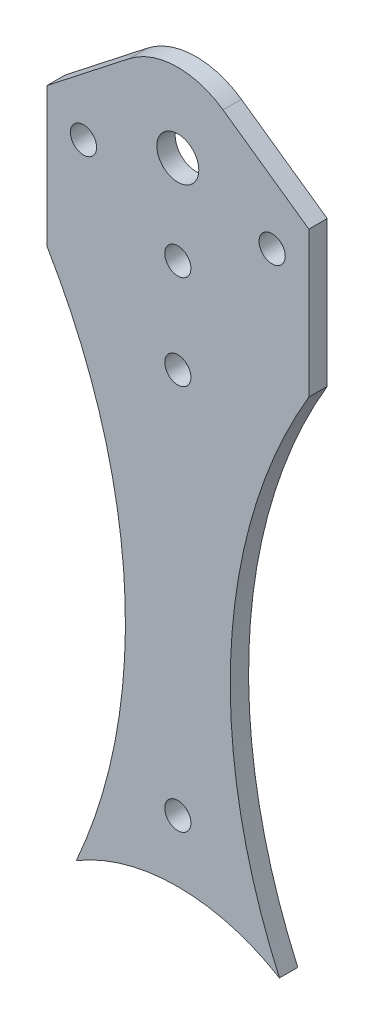
ISO-10303-21;
HEADER;
FILE_DESCRIPTION(('STEP AP214'),'2;1');
FILE_NAME('part.step','',(''),(''),'','','');
FILE_SCHEMA(('AUTOMOTIVE_DESIGN { 1 0 10303 214 1 1 1 1 }'));
ENDSEC;
DATA;
#1=APPLICATION_CONTEXT('core data for automotive mechanical design processes');
#2=APPLICATION_PROTOCOL_DEFINITION('international standard','automotive_design',2000,#1);
#3=PRODUCT_CONTEXT('',#1,'mechanical');
#4=PRODUCT('Part','Part','',(#3));
#5=PRODUCT_RELATED_PRODUCT_CATEGORY('part','',(#4));
#6=PRODUCT_DEFINITION_FORMATION('','',#4);
#7=PRODUCT_DEFINITION_CONTEXT('part definition',#1,'design');
#8=PRODUCT_DEFINITION('design','',#6,#7);
#9=PRODUCT_DEFINITION_SHAPE('','',#8);
#10=(LENGTH_UNIT() NAMED_UNIT(*) SI_UNIT(.MILLI.,.METRE.));
#11=(NAMED_UNIT(*) PLANE_ANGLE_UNIT() SI_UNIT($,.RADIAN.));
#12=(NAMED_UNIT(*) SI_UNIT($,.STERADIAN.) SOLID_ANGLE_UNIT());
#13=UNCERTAINTY_MEASURE_WITH_UNIT(LENGTH_MEASURE(1.E-05),#10,'distance_accuracy_value','');
#14=(GEOMETRIC_REPRESENTATION_CONTEXT(3) GLOBAL_UNCERTAINTY_ASSIGNED_CONTEXT((#13)) GLOBAL_UNIT_ASSIGNED_CONTEXT((#10,
#11,#12)) REPRESENTATION_CONTEXT('',''));
#15=CARTESIAN_POINT('',(0.,0.,0.));
#16=DIRECTION('',(0.,0.,1.));
#17=DIRECTION('',(1.,0.,0.));
#18=AXIS2_PLACEMENT_3D('',#15,#16,#17);
#19=CARTESIAN_POINT('',(31.75,0.,4.445));
#20=DIRECTION('',(1.,0.,0.));
#21=DIRECTION('',(0.,1.,0.));
#22=AXIS2_PLACEMENT_3D('',#19,#20,#21);
#23=PLANE('',#22);
#24=DIRECTION('',(0.,-1.,0.));
#25=VECTOR('',#24,1.);
#26=CARTESIAN_POINT('',(31.75,0.,0.));
#27=LINE('',#26,#25);
#28=CARTESIAN_POINT('',(31.75,87.7278500626216,0.));
#29=VERTEX_POINT('',#28);
#30=CARTESIAN_POINT('',(31.75,52.48275,0.));
#31=VERTEX_POINT('',#30);
#32=EDGE_CURVE('E192',#29,#31,#27,.T.);
#33=ORIENTED_EDGE('',*,*,#32,.F.);
#34=DIRECTION('',(0.,0.,1.));
#35=VECTOR('',#34,1.);
#36=CARTESIAN_POINT('',(31.75,87.7278500626216,0.));
#37=LINE('',#36,#35);
#38=CARTESIAN_POINT('',(31.75,87.7278500626216,4.445));
#39=VERTEX_POINT('',#38);
#40=EDGE_CURVE('E54',#29,#39,#37,.T.);
#41=ORIENTED_EDGE('',*,*,#40,.T.);
#42=DIRECTION('',(0.,-1.,0.));
#43=VECTOR('',#42,1.);
#44=CARTESIAN_POINT('',(31.75,0.,4.445));
#45=LINE('',#44,#43);
#46=CARTESIAN_POINT('',(31.75,52.48275,4.445));
#47=VERTEX_POINT('',#46);
#48=EDGE_CURVE('E171',#39,#47,#45,.T.);
#49=ORIENTED_EDGE('',*,*,#48,.T.);
#50=DIRECTION('',(0.,0.,-1.));
#51=VECTOR('',#50,1.);
#52=CARTESIAN_POINT('',(31.75,52.48275,4.445));
#53=LINE('',#52,#51);
#54=EDGE_CURVE('E11',#47,#31,#53,.T.);
#55=ORIENTED_EDGE('',*,*,#54,.T.);
#56=EDGE_LOOP('',(#33,#41,#49,#55));
#57=FACE_BOUND('',#56,.T.);
#58=ADVANCED_FACE('F39',(#57),#23,.T.);
#59=CARTESIAN_POINT('',(149.469713125,-17.1449999999999,4.445));
#60=DIRECTION('',(0.,0.,-1.));
#61=DIRECTION('',(-1.,0.,0.));
#62=AXIS2_PLACEMENT_3D('',#59,#60,#61);
#63=CYLINDRICAL_SURFACE('',#62,136.769713125);
#64=CARTESIAN_POINT('',(149.469713125,-17.1449999999999,4.445));
#65=DIRECTION('',(0.,0.,1.));
#66=DIRECTION('',(1.,0.,0.));
#67=AXIS2_PLACEMENT_3D('',#64,#65,#66);
#68=CIRCLE('',#67,136.769713125);
#69=CARTESIAN_POINT('',(24.6225121024559,-72.9941792699878,4.445));
#70=VERTEX_POINT('',#69);
#71=EDGE_CURVE('E170',#70,#47,#68,.F.);
#72=ORIENTED_EDGE('',*,*,#71,.F.);
#73=DIRECTION('',(0.,0.,1.));
#74=VECTOR('',#73,1.);
#75=CARTESIAN_POINT('',(24.6225121024559,-72.9941792699878,2.2225));
#76=LINE('',#75,#74);
#77=CARTESIAN_POINT('',(24.6225121024559,-72.9941792699878,0.));
#78=VERTEX_POINT('',#77);
#79=EDGE_CURVE('E141',#70,#78,#76,.F.);
#80=ORIENTED_EDGE('',*,*,#79,.T.);
#81=CARTESIAN_POINT('',(149.469713125,-17.1449999999999,0.));
#82=DIRECTION('',(0.,0.,1.));
#83=DIRECTION('',(1.,0.,0.));
#84=AXIS2_PLACEMENT_3D('',#81,#82,#83);
#85=CIRCLE('',#84,136.769713125);
#86=EDGE_CURVE('E191',#78,#31,#85,.F.);
#87=ORIENTED_EDGE('',*,*,#86,.T.);
#88=ORIENTED_EDGE('',*,*,#54,.F.);
#89=EDGE_LOOP('',(#72,#80,#87,#88));
#90=FACE_BOUND('',#89,.T.);
#91=ADVANCED_FACE('F214',(#90),#63,.F.);
#92=CARTESIAN_POINT('',(-31.75,0.,4.445));
#93=DIRECTION('',(1.,0.,0.));
#94=DIRECTION('',(0.,1.,0.));
#95=AXIS2_PLACEMENT_3D('',#92,#93,#94);
#96=PLANE('',#95);
#97=DIRECTION('',(0.,-1.,0.));
#98=VECTOR('',#97,1.);
#99=CARTESIAN_POINT('',(-31.75,0.,4.445));
#100=LINE('',#99,#98);
#101=CARTESIAN_POINT('',(-31.75,86.0944421154927,4.445));
#102=VERTEX_POINT('',#101);
#103=CARTESIAN_POINT('',(-31.75,52.48275,4.445));
#104=VERTEX_POINT('',#103);
#105=EDGE_CURVE('E173',#102,#104,#100,.T.);
#106=ORIENTED_EDGE('',*,*,#105,.F.);
#107=DIRECTION('',(0.,0.,1.));
#108=VECTOR('',#107,1.);
#109=CARTESIAN_POINT('',(-31.75,86.0944421154927,0.));
#110=LINE('',#109,#108);
#111=CARTESIAN_POINT('',(-31.75,86.0944421154927,0.));
#112=VERTEX_POINT('',#111);
#113=EDGE_CURVE('E134',#112,#102,#110,.T.);
#114=ORIENTED_EDGE('',*,*,#113,.F.);
#115=DIRECTION('',(0.,-1.,0.));
#116=VECTOR('',#115,1.);
#117=CARTESIAN_POINT('',(-31.75,0.,0.));
#118=LINE('',#117,#116);
#119=CARTESIAN_POINT('',(-31.75,52.48275,0.));
#120=VERTEX_POINT('',#119);
#121=EDGE_CURVE('E194',#112,#120,#118,.T.);
#122=ORIENTED_EDGE('',*,*,#121,.T.);
#123=DIRECTION('',(0.,0.,-1.));
#124=VECTOR('',#123,1.);
#125=CARTESIAN_POINT('',(-31.75,52.48275,4.445));
#126=LINE('',#125,#124);
#127=EDGE_CURVE('E47',#104,#120,#126,.T.);
#128=ORIENTED_EDGE('',*,*,#127,.F.);
#129=EDGE_LOOP('',(#106,#114,#122,#128));
#130=FACE_BOUND('',#129,.T.);
#131=ADVANCED_FACE('F207',(#130),#96,.F.);
#132=CARTESIAN_POINT('',(-149.469713125,-17.145,4.445));
#133=DIRECTION('',(0.,0.,-1.));
#134=DIRECTION('',(-1.,0.,0.));
#135=AXIS2_PLACEMENT_3D('',#132,#133,#134);
#136=CYLINDRICAL_SURFACE('',#135,136.769713125);
#137=DIRECTION('',(0.,0.,1.));
#138=VECTOR('',#137,1.);
#139=CARTESIAN_POINT('',(-24.6225121024549,-72.9941792699857,2.2225));
#140=LINE('',#139,#138);
#141=CARTESIAN_POINT('',(-24.6225121024549,-72.9941792699857,4.445));
#142=VERTEX_POINT('',#141);
#143=CARTESIAN_POINT('',(-24.6225121024549,-72.9941792699857,0.));
#144=VERTEX_POINT('',#143);
#145=EDGE_CURVE('E62',#142,#144,#140,.F.);
#146=ORIENTED_EDGE('',*,*,#145,.F.);
#147=CARTESIAN_POINT('',(-149.469713125,-17.145,4.445));
#148=DIRECTION('',(0.,0.,1.));
#149=DIRECTION('',(1.,0.,0.));
#150=AXIS2_PLACEMENT_3D('',#147,#148,#149);
#151=CIRCLE('',#150,136.769713125);
#152=EDGE_CURVE('E177',#142,#104,#151,.T.);
#153=ORIENTED_EDGE('',*,*,#152,.T.);
#154=ORIENTED_EDGE('',*,*,#127,.T.);
#155=CARTESIAN_POINT('',(-149.469713125,-17.145,0.));
#156=DIRECTION('',(0.,0.,1.));
#157=DIRECTION('',(1.,0.,0.));
#158=AXIS2_PLACEMENT_3D('',#155,#156,#157);
#159=CIRCLE('',#158,136.769713125);
#160=EDGE_CURVE('E161',#144,#120,#159,.T.);
#161=ORIENTED_EDGE('',*,*,#160,.F.);
#162=EDGE_LOOP('',(#146,#153,#154,#161));
#163=FACE_BOUND('',#162,.T.);
#164=ADVANCED_FACE('F203',(#163),#136,.F.);
#165=CARTESIAN_POINT('',(22.86,79.1527500000001,4.445));
#166=DIRECTION('',(0.,0.,-1.));
#167=DIRECTION('',(-1.,0.,0.));
#168=AXIS2_PLACEMENT_3D('',#165,#166,#167);
#169=CYLINDRICAL_SURFACE('',#168,3.175);
#170=CARTESIAN_POINT('',(22.86,79.1527500000001,4.445));
#171=DIRECTION('',(0.,0.,1.));
#172=DIRECTION('',(1.,0.,0.));
#173=AXIS2_PLACEMENT_3D('',#170,#171,#172);
#174=CIRCLE('',#173,3.175);
#175=CARTESIAN_POINT('',(26.035,79.1527500000001,4.445));
#176=VERTEX_POINT('',#175);
#177=EDGE_CURVE('E167',#176,#176,#174,.T.);
#178=ORIENTED_EDGE('',*,*,#177,.T.);
#179=EDGE_LOOP('',(#178));
#180=FACE_BOUND('',#179,.T.);
#181=CARTESIAN_POINT('',(22.86,79.1527500000001,0.));
#182=DIRECTION('',(0.,0.,1.));
#183=DIRECTION('',(1.,0.,0.));
#184=AXIS2_PLACEMENT_3D('',#181,#182,#183);
#185=CIRCLE('',#184,3.175);
#186=CARTESIAN_POINT('',(26.035,79.1527500000001,0.));
#187=VERTEX_POINT('',#186);
#188=EDGE_CURVE('E188',#187,#187,#185,.T.);
#189=ORIENTED_EDGE('',*,*,#188,.F.);
#190=EDGE_LOOP('',(#189));
#191=FACE_BOUND('',#190,.T.);
#192=ADVANCED_FACE('F241',(#180,#191),#169,.F.);
#193=CARTESIAN_POINT('',(-22.86,79.1527500000001,4.445));
#194=DIRECTION('',(0.,0.,-1.));
#195=DIRECTION('',(-1.,0.,0.));
#196=AXIS2_PLACEMENT_3D('',#193,#194,#195);
#197=CYLINDRICAL_SURFACE('',#196,3.175);
#198=CARTESIAN_POINT('',(-22.86,79.1527500000001,4.445));
#199=DIRECTION('',(0.,0.,1.));
#200=DIRECTION('',(1.,0.,0.));
#201=AXIS2_PLACEMENT_3D('',#198,#199,#200);
#202=CIRCLE('',#201,3.175);
#203=CARTESIAN_POINT('',(-19.685,79.1527500000001,4.445));
#204=VERTEX_POINT('',#203);
#205=EDGE_CURVE('E164',#204,#204,#202,.T.);
#206=ORIENTED_EDGE('',*,*,#205,.T.);
#207=EDGE_LOOP('',(#206));
#208=FACE_BOUND('',#207,.T.);
#209=CARTESIAN_POINT('',(-22.86,79.1527500000001,0.));
#210=DIRECTION('',(0.,0.,1.));
#211=DIRECTION('',(1.,0.,0.));
#212=AXIS2_PLACEMENT_3D('',#209,#210,#211);
#213=CIRCLE('',#212,3.175);
#214=CARTESIAN_POINT('',(-19.685,79.1527500000001,0.));
#215=VERTEX_POINT('',#214);
#216=EDGE_CURVE('E185',#215,#215,#213,.T.);
#217=ORIENTED_EDGE('',*,*,#216,.F.);
#218=EDGE_LOOP('',(#217));
#219=FACE_BOUND('',#218,.T.);
#220=ADVANCED_FACE('F244',(#208,#219),#197,.F.);
#221=CARTESIAN_POINT('',(0.,65.1827500000001,4.445));
#222=DIRECTION('',(0.,0.,-1.));
#223=DIRECTION('',(-1.,0.,0.));
#224=AXIS2_PLACEMENT_3D('',#221,#222,#223);
#225=CYLINDRICAL_SURFACE('',#224,3.175);
#226=CARTESIAN_POINT('',(0.,65.1827500000001,4.445));
#227=DIRECTION('',(0.,0.,1.));
#228=DIRECTION('',(1.,0.,0.));
#229=AXIS2_PLACEMENT_3D('',#226,#227,#228);
#230=CIRCLE('',#229,3.175);
#231=CARTESIAN_POINT('',(3.175,65.1827500000001,4.445));
#232=VERTEX_POINT('',#231);
#233=EDGE_CURVE('E160',#232,#232,#230,.T.);
#234=ORIENTED_EDGE('',*,*,#233,.T.);
#235=EDGE_LOOP('',(#234));
#236=FACE_BOUND('',#235,.T.);
#237=CARTESIAN_POINT('',(0.,65.1827500000001,0.));
#238=DIRECTION('',(0.,0.,1.));
#239=DIRECTION('',(1.,0.,0.));
#240=AXIS2_PLACEMENT_3D('',#237,#238,#239);
#241=CIRCLE('',#240,3.175);
#242=CARTESIAN_POINT('',(3.175,65.1827500000001,0.));
#243=VERTEX_POINT('',#242);
#244=EDGE_CURVE('E182',#243,#243,#241,.T.);
#245=ORIENTED_EDGE('',*,*,#244,.F.);
#246=EDGE_LOOP('',(#245));
#247=FACE_BOUND('',#246,.T.);
#248=ADVANCED_FACE('F247',(#236,#247),#225,.F.);
#249=CARTESIAN_POINT('',(0.,86.77275,4.445));
#250=DIRECTION('',(0.,0.,-1.));
#251=DIRECTION('',(-1.,0.,0.));
#252=AXIS2_PLACEMENT_3D('',#249,#250,#251);
#253=CYLINDRICAL_SURFACE('',#252,5.08);
#254=CARTESIAN_POINT('',(0.,86.77275,4.445));
#255=DIRECTION('',(0.,0.,1.));
#256=DIRECTION('',(1.,0.,0.));
#257=AXIS2_PLACEMENT_3D('',#254,#255,#256);
#258=CIRCLE('',#257,5.08);
#259=CARTESIAN_POINT('',(5.08,86.77275,4.445));
#260=VERTEX_POINT('',#259);
#261=EDGE_CURVE('E157',#260,#260,#258,.T.);
#262=ORIENTED_EDGE('',*,*,#261,.T.);
#263=EDGE_LOOP('',(#262));
#264=FACE_BOUND('',#263,.T.);
#265=CARTESIAN_POINT('',(0.,86.77275,0.));
#266=DIRECTION('',(0.,0.,1.));
#267=DIRECTION('',(1.,0.,0.));
#268=AXIS2_PLACEMENT_3D('',#265,#266,#267);
#269=CIRCLE('',#268,5.08);
#270=CARTESIAN_POINT('',(5.08,86.77275,0.));
#271=VERTEX_POINT('',#270);
#272=EDGE_CURVE('E154',#271,#271,#269,.T.);
#273=ORIENTED_EDGE('',*,*,#272,.F.);
#274=EDGE_LOOP('',(#273));
#275=FACE_BOUND('',#274,.T.);
#276=ADVANCED_FACE('F41',(#264,#275),#253,.F.);
#277=CARTESIAN_POINT('',(0.,0.,4.445));
#278=DIRECTION('',(0.,0.,1.));
#279=DIRECTION('',(1.,0.,0.));
#280=AXIS2_PLACEMENT_3D('',#277,#278,#279);
#281=PLANE('',#280);
#282=DIRECTION('',(0.787107543045303,0.616815787477256,0.));
#283=VECTOR('',#282,1.);
#284=CARTESIAN_POINT('',(-53.8785420272322,68.7534393556383,4.445));
#285=LINE('',#284,#283);
#286=CARTESIAN_POINT('',(-11.7503407514418,101.767148695013,4.445));
#287=VERTEX_POINT('',#286);
#288=EDGE_CURVE('E122',#102,#287,#285,.T.);
#289=ORIENTED_EDGE('',*,*,#288,.F.);
#290=ORIENTED_EDGE('',*,*,#105,.T.);
#291=ORIENTED_EDGE('',*,*,#152,.F.);
#292=CARTESIAN_POINT('',(-1.20799881819511E-12,-113.76025,4.445));
#293=DIRECTION('',(0.,0.,1.));
#294=DIRECTION('',(1.,0.,0.));
#295=AXIS2_PLACEMENT_3D('',#292,#293,#294);
#296=CIRCLE('',#295,47.625);
#297=EDGE_CURVE('E133',#70,#142,#296,.T.);
#298=ORIENTED_EDGE('',*,*,#297,.F.);
#299=ORIENTED_EDGE('',*,*,#71,.T.);
#300=ORIENTED_EDGE('',*,*,#48,.F.);
#301=DIRECTION('',(-0.817874399318846,0.575396790865953,0.));
#302=VECTOR('',#301,1.);
#303=CARTESIAN_POINT('',(51.7967650011085,73.6244079467071,4.445));
#304=LINE('',#303,#302);
#305=CARTESIAN_POINT('',(10.9613088659964,102.353257307024,4.445));
#306=VERTEX_POINT('',#305);
#307=EDGE_CURVE('E125',#39,#306,#304,.T.);
#308=ORIENTED_EDGE('',*,*,#307,.T.);
#309=CARTESIAN_POINT('',(0.,86.77275,4.445));
#310=DIRECTION('',(0.,0.,1.));
#311=DIRECTION('',(1.,0.,0.));
#312=AXIS2_PLACEMENT_3D('',#309,#310,#311);
#313=CIRCLE('',#312,19.05);
#314=EDGE_CURVE('E116',#306,#287,#313,.T.);
#315=ORIENTED_EDGE('',*,*,#314,.T.);
#316=EDGE_LOOP('',(#289,#290,#291,#298,#299,#300,#308,#315));
#317=FACE_BOUND('',#316,.T.);
#318=CARTESIAN_POINT('',(0.,-51.21275,4.445));
#319=DIRECTION('',(0.,0.,1.));
#320=DIRECTION('',(1.,0.,0.));
#321=AXIS2_PLACEMENT_3D('',#318,#319,#320);
#322=CIRCLE('',#321,3.175);
#323=CARTESIAN_POINT('',(3.175,-51.21275,4.445));
#324=VERTEX_POINT('',#323);
#325=EDGE_CURVE('E144',#324,#324,#322,.T.);
#326=ORIENTED_EDGE('',*,*,#325,.F.);
#327=EDGE_LOOP('',(#326));
#328=FACE_BOUND('',#327,.T.);
#329=CARTESIAN_POINT('',(0.,42.3227500000001,4.445));
#330=DIRECTION('',(0.,0.,1.));
#331=DIRECTION('',(1.,0.,0.));
#332=AXIS2_PLACEMENT_3D('',#329,#330,#331);
#333=CIRCLE('',#332,3.175);
#334=CARTESIAN_POINT('',(3.175,42.3227500000001,4.445));
#335=VERTEX_POINT('',#334);
#336=EDGE_CURVE('E148',#335,#335,#333,.T.);
#337=ORIENTED_EDGE('',*,*,#336,.F.);
#338=EDGE_LOOP('',(#337));
#339=FACE_BOUND('',#338,.T.);
#340=ORIENTED_EDGE('',*,*,#261,.F.);
#341=EDGE_LOOP('',(#340));
#342=FACE_BOUND('',#341,.T.);
#343=ORIENTED_EDGE('',*,*,#233,.F.);
#344=EDGE_LOOP('',(#343));
#345=FACE_BOUND('',#344,.T.);
#346=ORIENTED_EDGE('',*,*,#205,.F.);
#347=EDGE_LOOP('',(#346));
#348=FACE_BOUND('',#347,.T.);
#349=ORIENTED_EDGE('',*,*,#177,.F.);
#350=EDGE_LOOP('',(#349));
#351=FACE_BOUND('',#350,.T.);
#352=ADVANCED_FACE('F219',(#317,#328,#339,#342,#345,#348,#351),#281,.T.);
#353=CARTESIAN_POINT('',(0.,0.,0.));
#354=DIRECTION('',(0.,0.,1.));
#355=DIRECTION('',(1.,0.,0.));
#356=AXIS2_PLACEMENT_3D('',#353,#354,#355);
#357=PLANE('',#356);
#358=CARTESIAN_POINT('',(0.,-51.21275,0.));
#359=DIRECTION('',(0.,0.,1.));
#360=DIRECTION('',(1.,0.,0.));
#361=AXIS2_PLACEMENT_3D('',#358,#359,#360);
#362=CIRCLE('',#361,3.175);
#363=CARTESIAN_POINT('',(3.175,-51.21275,0.));
#364=VERTEX_POINT('',#363);
#365=EDGE_CURVE('E145',#364,#364,#362,.T.);
#366=ORIENTED_EDGE('',*,*,#365,.T.);
#367=EDGE_LOOP('',(#366));
#368=FACE_BOUND('',#367,.T.);
#369=CARTESIAN_POINT('',(0.,42.3227500000001,0.));
#370=DIRECTION('',(0.,0.,1.));
#371=DIRECTION('',(1.,0.,0.));
#372=AXIS2_PLACEMENT_3D('',#369,#370,#371);
#373=CIRCLE('',#372,3.175);
#374=CARTESIAN_POINT('',(3.175,42.3227500000001,0.));
#375=VERTEX_POINT('',#374);
#376=EDGE_CURVE('E151',#375,#375,#373,.T.);
#377=ORIENTED_EDGE('',*,*,#376,.T.);
#378=EDGE_LOOP('',(#377));
#379=FACE_BOUND('',#378,.T.);
#380=ORIENTED_EDGE('',*,*,#272,.T.);
#381=EDGE_LOOP('',(#380));
#382=FACE_BOUND('',#381,.T.);
#383=ORIENTED_EDGE('',*,*,#244,.T.);
#384=EDGE_LOOP('',(#383));
#385=FACE_BOUND('',#384,.T.);
#386=ORIENTED_EDGE('',*,*,#216,.T.);
#387=EDGE_LOOP('',(#386));
#388=FACE_BOUND('',#387,.T.);
#389=ORIENTED_EDGE('',*,*,#188,.T.);
#390=EDGE_LOOP('',(#389));
#391=FACE_BOUND('',#390,.T.);
#392=ORIENTED_EDGE('',*,*,#121,.F.);
#393=DIRECTION('',(0.787107543045303,0.616815787477256,0.));
#394=VECTOR('',#393,1.);
#395=CARTESIAN_POINT('',(-53.8785420272322,68.7534393556383,0.));
#396=LINE('',#395,#394);
#397=CARTESIAN_POINT('',(-11.7503407514418,101.767148695013,0.));
#398=VERTEX_POINT('',#397);
#399=EDGE_CURVE('E109',#112,#398,#396,.T.);
#400=ORIENTED_EDGE('',*,*,#399,.T.);
#401=CARTESIAN_POINT('',(0.,86.77275,0.));
#402=DIRECTION('',(0.,0.,1.));
#403=DIRECTION('',(1.,0.,0.));
#404=AXIS2_PLACEMENT_3D('',#401,#402,#403);
#405=CIRCLE('',#404,19.05);
#406=CARTESIAN_POINT('',(10.9613088659964,102.353257307024,0.));
#407=VERTEX_POINT('',#406);
#408=EDGE_CURVE('E110',#407,#398,#405,.T.);
#409=ORIENTED_EDGE('',*,*,#408,.F.);
#410=DIRECTION('',(-0.817874399318846,0.575396790865953,0.));
#411=VECTOR('',#410,1.);
#412=CARTESIAN_POINT('',(51.7967650011085,73.6244079467071,0.));
#413=LINE('',#412,#411);
#414=EDGE_CURVE('E101',#29,#407,#413,.T.);
#415=ORIENTED_EDGE('',*,*,#414,.F.);
#416=ORIENTED_EDGE('',*,*,#32,.T.);
#417=ORIENTED_EDGE('',*,*,#86,.F.);
#418=CARTESIAN_POINT('',(-1.20799881819511E-12,-113.76025,0.));
#419=DIRECTION('',(0.,0.,1.));
#420=DIRECTION('',(1.,0.,0.));
#421=AXIS2_PLACEMENT_3D('',#418,#419,#420);
#422=CIRCLE('',#421,47.625);
#423=EDGE_CURVE('E137',#78,#144,#422,.T.);
#424=ORIENTED_EDGE('',*,*,#423,.T.);
#425=ORIENTED_EDGE('',*,*,#160,.T.);
#426=EDGE_LOOP('',(#392,#400,#409,#415,#416,#417,#424,#425));
#427=FACE_BOUND('',#426,.T.);
#428=ADVANCED_FACE('F121',(#368,#379,#382,#385,#388,#391,#427),#357,.F.);
#429=CARTESIAN_POINT('',(0.,42.3227500000001,0.));
#430=DIRECTION('',(0.,0.,1.));
#431=DIRECTION('',(1.,0.,0.));
#432=AXIS2_PLACEMENT_3D('',#429,#430,#431);
#433=CYLINDRICAL_SURFACE('',#432,3.175);
#434=ORIENTED_EDGE('',*,*,#376,.F.);
#435=EDGE_LOOP('',(#434));
#436=FACE_BOUND('',#435,.T.);
#437=ORIENTED_EDGE('',*,*,#336,.T.);
#438=EDGE_LOOP('',(#437));
#439=FACE_BOUND('',#438,.T.);
#440=ADVANCED_FACE('F261',(#436,#439),#433,.F.);
#441=CARTESIAN_POINT('',(0.,-51.21275,0.));
#442=DIRECTION('',(0.,0.,1.));
#443=DIRECTION('',(1.,0.,0.));
#444=AXIS2_PLACEMENT_3D('',#441,#442,#443);
#445=CYLINDRICAL_SURFACE('',#444,3.175);
#446=ORIENTED_EDGE('',*,*,#365,.F.);
#447=EDGE_LOOP('',(#446));
#448=FACE_BOUND('',#447,.T.);
#449=ORIENTED_EDGE('',*,*,#325,.T.);
#450=EDGE_LOOP('',(#449));
#451=FACE_BOUND('',#450,.T.);
#452=ADVANCED_FACE('F273',(#448,#451),#445,.F.);
#453=CARTESIAN_POINT('',(-1.20799881819511E-12,-113.76025,0.));
#454=DIRECTION('',(0.,0.,1.));
#455=DIRECTION('',(1.,0.,0.));
#456=AXIS2_PLACEMENT_3D('',#453,#454,#455);
#457=CYLINDRICAL_SURFACE('',#456,47.625);
#458=ORIENTED_EDGE('',*,*,#297,.T.);
#459=ORIENTED_EDGE('',*,*,#145,.T.);
#460=ORIENTED_EDGE('',*,*,#423,.F.);
#461=ORIENTED_EDGE('',*,*,#79,.F.);
#462=EDGE_LOOP('',(#458,#459,#460,#461));
#463=FACE_BOUND('',#462,.T.);
#464=ADVANCED_FACE('F210',(#463),#457,.F.);
#465=CARTESIAN_POINT('',(0.,86.77275,0.));
#466=DIRECTION('',(0.,0.,1.));
#467=DIRECTION('',(1.,0.,0.));
#468=AXIS2_PLACEMENT_3D('',#465,#466,#467);
#469=CYLINDRICAL_SURFACE('',#468,19.05);
#470=ORIENTED_EDGE('',*,*,#314,.F.);
#471=DIRECTION('',(0.,0.,1.));
#472=VECTOR('',#471,1.);
#473=CARTESIAN_POINT('',(10.9613088659964,102.353257307024,0.));
#474=LINE('',#473,#472);
#475=EDGE_CURVE('E104',#407,#306,#474,.T.);
#476=ORIENTED_EDGE('',*,*,#475,.F.);
#477=ORIENTED_EDGE('',*,*,#408,.T.);
#478=DIRECTION('',(0.,0.,1.));
#479=VECTOR('',#478,1.);
#480=CARTESIAN_POINT('',(-11.7503407514418,101.767148695013,0.));
#481=LINE('',#480,#479);
#482=EDGE_CURVE('E131',#398,#287,#481,.T.);
#483=ORIENTED_EDGE('',*,*,#482,.T.);
#484=EDGE_LOOP('',(#470,#476,#477,#483));
#485=FACE_BOUND('',#484,.T.);
#486=ADVANCED_FACE('F113',(#485),#469,.T.);
#487=CARTESIAN_POINT('',(-53.8785420272322,68.7534393556383,0.));
#488=DIRECTION('',(0.616815787477256,-0.787107543045302,0.));
#489=DIRECTION('',(0.787107543045303,0.616815787477256,0.));
#490=AXIS2_PLACEMENT_3D('',#487,#488,#489);
#491=PLANE('',#490);
#492=ORIENTED_EDGE('',*,*,#288,.T.);
#493=ORIENTED_EDGE('',*,*,#482,.F.);
#494=ORIENTED_EDGE('',*,*,#399,.F.);
#495=ORIENTED_EDGE('',*,*,#113,.T.);
#496=EDGE_LOOP('',(#492,#493,#494,#495));
#497=FACE_BOUND('',#496,.T.);
#498=ADVANCED_FACE('F222',(#497),#491,.F.);
#499=CARTESIAN_POINT('',(51.7967650011085,73.6244079467071,0.));
#500=DIRECTION('',(0.575396790865953,0.817874399318846,0.));
#501=DIRECTION('',(-0.817874399318846,0.575396790865953,0.));
#502=AXIS2_PLACEMENT_3D('',#499,#500,#501);
#503=PLANE('',#502);
#504=ORIENTED_EDGE('',*,*,#307,.F.);
#505=ORIENTED_EDGE('',*,*,#40,.F.);
#506=ORIENTED_EDGE('',*,*,#414,.T.);
#507=ORIENTED_EDGE('',*,*,#475,.T.);
#508=EDGE_LOOP('',(#504,#505,#506,#507));
#509=FACE_BOUND('',#508,.T.);
#510=ADVANCED_FACE('F103',(#509),#503,.T.);
#511=CLOSED_SHELL('',(#58,#91,#131,#164,#192,#220,#248,#276,#352,#428,#440,#452,#464,#486,#498,#510));
#512=MANIFOLD_SOLID_BREP('B2',#511);
#513=ADVANCED_BREP_SHAPE_REPRESENTATION('',(#18,#512),#14);
#514=SHAPE_DEFINITION_REPRESENTATION(#9,#513);
ENDSEC;
END-ISO-10303-21;
